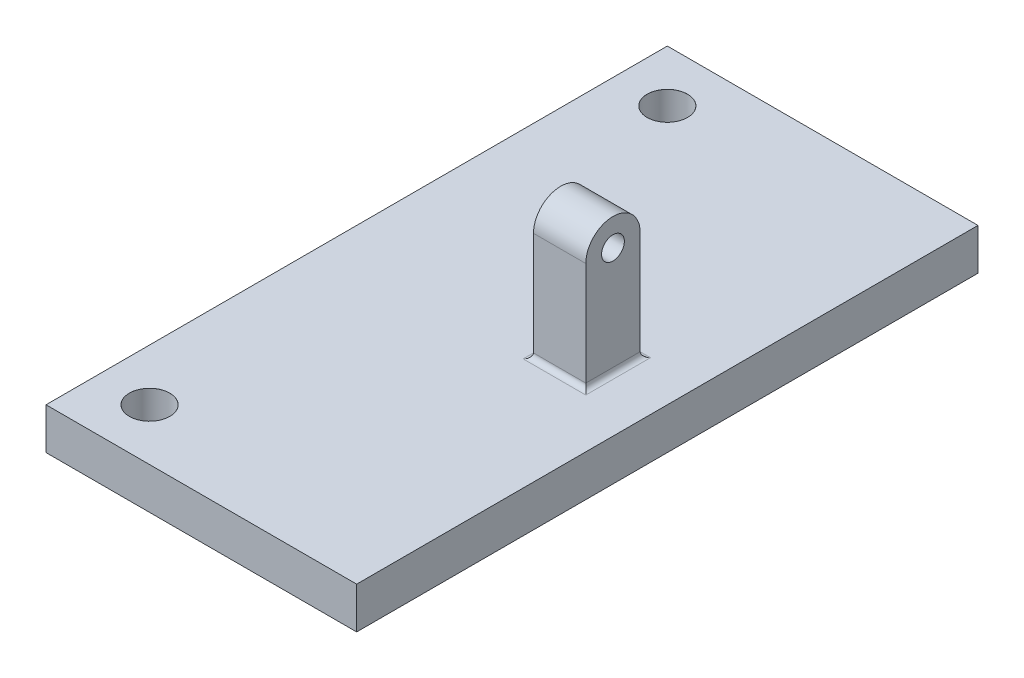
ISO-10303-21;
HEADER;
FILE_DESCRIPTION(('STEP AP214'),'2;1');
FILE_NAME('part.step','',(''),(''),'','','');
FILE_SCHEMA(('AUTOMOTIVE_DESIGN { 1 0 10303 214 1 1 1 1 }'));
ENDSEC;
DATA;
#1=APPLICATION_CONTEXT('core data for automotive mechanical design processes');
#2=APPLICATION_PROTOCOL_DEFINITION('international standard','automotive_design',2000,#1);
#3=PRODUCT_CONTEXT('',#1,'mechanical');
#4=PRODUCT('Part','Part','',(#3));
#5=PRODUCT_RELATED_PRODUCT_CATEGORY('part','',(#4));
#6=PRODUCT_DEFINITION_FORMATION('','',#4);
#7=PRODUCT_DEFINITION_CONTEXT('part definition',#1,'design');
#8=PRODUCT_DEFINITION('design','',#6,#7);
#9=PRODUCT_DEFINITION_SHAPE('','',#8);
#10=(LENGTH_UNIT() NAMED_UNIT(*) SI_UNIT(.MILLI.,.METRE.));
#11=(NAMED_UNIT(*) PLANE_ANGLE_UNIT() SI_UNIT($,.RADIAN.));
#12=(NAMED_UNIT(*) SI_UNIT($,.STERADIAN.) SOLID_ANGLE_UNIT());
#13=UNCERTAINTY_MEASURE_WITH_UNIT(LENGTH_MEASURE(1.E-05),#10,'distance_accuracy_value','');
#14=(GEOMETRIC_REPRESENTATION_CONTEXT(3) GLOBAL_UNCERTAINTY_ASSIGNED_CONTEXT((#13)) GLOBAL_UNIT_ASSIGNED_CONTEXT((#10,
#11,#12)) REPRESENTATION_CONTEXT('',''));
#15=CARTESIAN_POINT('',(0.,0.,0.));
#16=DIRECTION('',(0.,0.,1.));
#17=DIRECTION('',(1.,0.,0.));
#18=AXIS2_PLACEMENT_3D('',#15,#16,#17);
#19=CARTESIAN_POINT('',(50.5,0.,0.));
#20=DIRECTION('',(-1.,0.,0.));
#21=DIRECTION('',(0.,0.,1.));
#22=AXIS2_PLACEMENT_3D('',#19,#20,#21);
#23=CYLINDRICAL_SURFACE('',#22,26.25);
#24=CARTESIAN_POINT('',(0.,0.,0.));
#25=DIRECTION('',(1.,0.,0.));
#26=DIRECTION('',(0.,0.,1.));
#27=AXIS2_PLACEMENT_3D('',#24,#25,#26);
#28=CIRCLE('',#27,26.25);
#29=CARTESIAN_POINT('',(0.,0.,-26.25));
#30=VERTEX_POINT('',#29);
#31=CARTESIAN_POINT('',(0.,0.,26.25));
#32=VERTEX_POINT('',#31);
#33=EDGE_CURVE('E171',#30,#32,#28,.T.);
#34=ORIENTED_EDGE('',*,*,#33,.T.);
#35=DIRECTION('',(-1.,0.,0.));
#36=VECTOR('',#35,1.);
#37=CARTESIAN_POINT('',(50.5,0.,26.25));
#38=LINE('',#37,#36);
#39=CARTESIAN_POINT('',(50.5,0.,26.25));
#40=VERTEX_POINT('',#39);
#41=EDGE_CURVE('E195',#40,#32,#38,.T.);
#42=ORIENTED_EDGE('',*,*,#41,.F.);
#43=CARTESIAN_POINT('',(50.5,0.,0.));
#44=DIRECTION('',(1.,0.,0.));
#45=DIRECTION('',(0.,0.,1.));
#46=AXIS2_PLACEMENT_3D('',#43,#44,#45);
#47=CIRCLE('',#46,26.25);
#48=CARTESIAN_POINT('',(50.5,0.,-26.25));
#49=VERTEX_POINT('',#48);
#50=EDGE_CURVE('E172',#49,#40,#47,.T.);
#51=ORIENTED_EDGE('',*,*,#50,.F.);
#52=DIRECTION('',(-1.,0.,0.));
#53=VECTOR('',#52,1.);
#54=CARTESIAN_POINT('',(50.5,0.,-26.25));
#55=LINE('',#54,#53);
#56=EDGE_CURVE('E183',#49,#30,#55,.T.);
#57=ORIENTED_EDGE('',*,*,#56,.T.);
#58=EDGE_LOOP('',(#34,#42,#51,#57));
#59=FACE_BOUND('',#58,.T.);
#60=ADVANCED_FACE('F45',(#59),#23,.T.);
#61=CARTESIAN_POINT('',(50.5,0.,26.25));
#62=DIRECTION('',(0.,0.,-1.));
#63=DIRECTION('',(-1.,0.,0.));
#64=AXIS2_PLACEMENT_3D('',#61,#62,#63);
#65=PLANE('',#64);
#66=DIRECTION('',(0.,-1.,0.));
#67=VECTOR('',#66,1.);
#68=CARTESIAN_POINT('',(0.,0.,26.25));
#69=LINE('',#68,#67);
#70=CARTESIAN_POINT('',(0.,-100.,26.25));
#71=VERTEX_POINT('',#70);
#72=EDGE_CURVE('E187',#32,#71,#69,.T.);
#73=ORIENTED_EDGE('',*,*,#72,.T.);
#74=DIRECTION('',(-1.,0.,0.));
#75=VECTOR('',#74,1.);
#76=CARTESIAN_POINT('',(50.5,-100.,26.25));
#77=LINE('',#76,#75);
#78=CARTESIAN_POINT('',(50.5,-100.,26.25));
#79=VERTEX_POINT('',#78);
#80=EDGE_CURVE('E11',#71,#79,#77,.F.);
#81=ORIENTED_EDGE('',*,*,#80,.T.);
#82=DIRECTION('',(0.,-1.,0.));
#83=VECTOR('',#82,1.);
#84=CARTESIAN_POINT('',(50.5,0.,26.25));
#85=LINE('',#84,#83);
#86=EDGE_CURVE('E176',#40,#79,#85,.T.);
#87=ORIENTED_EDGE('',*,*,#86,.F.);
#88=ORIENTED_EDGE('',*,*,#41,.T.);
#89=EDGE_LOOP('',(#73,#81,#87,#88));
#90=FACE_BOUND('',#89,.T.);
#91=ADVANCED_FACE('F328',(#90),#65,.F.);
#92=CARTESIAN_POINT('',(50.5,-105.,-26.25));
#93=DIRECTION('',(0.,0.,1.));
#94=DIRECTION('',(1.,0.,0.));
#95=AXIS2_PLACEMENT_3D('',#92,#93,#94);
#96=PLANE('',#95);
#97=DIRECTION('',(0.,1.,0.));
#98=VECTOR('',#97,1.);
#99=CARTESIAN_POINT('',(50.5,-105.,-26.25));
#100=LINE('',#99,#98);
#101=CARTESIAN_POINT('',(50.5,-100.,-26.25));
#102=VERTEX_POINT('',#101);
#103=EDGE_CURVE('E180',#102,#49,#100,.T.);
#104=ORIENTED_EDGE('',*,*,#103,.F.);
#105=DIRECTION('',(-1.,0.,0.));
#106=VECTOR('',#105,1.);
#107=CARTESIAN_POINT('',(0.,-100.,-26.25));
#108=LINE('',#107,#106);
#109=CARTESIAN_POINT('',(0.,-100.,-26.25));
#110=VERTEX_POINT('',#109);
#111=EDGE_CURVE('E199',#102,#110,#108,.T.);
#112=ORIENTED_EDGE('',*,*,#111,.T.);
#113=DIRECTION('',(0.,1.,0.));
#114=VECTOR('',#113,1.);
#115=CARTESIAN_POINT('',(0.,-105.,-26.25));
#116=LINE('',#115,#114);
#117=EDGE_CURVE('E177',#110,#30,#116,.T.);
#118=ORIENTED_EDGE('',*,*,#117,.T.);
#119=ORIENTED_EDGE('',*,*,#56,.F.);
#120=EDGE_LOOP('',(#104,#112,#118,#119));
#121=FACE_BOUND('',#120,.T.);
#122=ADVANCED_FACE('F308',(#121),#96,.F.);
#123=CARTESIAN_POINT('',(50.5,0.,0.));
#124=DIRECTION('',(-1.,0.,0.));
#125=DIRECTION('',(0.,0.,1.));
#126=AXIS2_PLACEMENT_3D('',#123,#124,#125);
#127=PLANE('',#126);
#128=CARTESIAN_POINT('',(50.5,0.,0.));
#129=DIRECTION('',(-1.,0.,0.));
#130=DIRECTION('',(0.,0.,1.));
#131=AXIS2_PLACEMENT_3D('',#128,#129,#130);
#132=CIRCLE('',#131,11.);
#133=CARTESIAN_POINT('',(50.5,0.,11.));
#134=VERTEX_POINT('',#133);
#135=EDGE_CURVE('E167',#134,#134,#132,.T.);
#136=ORIENTED_EDGE('',*,*,#135,.T.);
#137=EDGE_LOOP('',(#136));
#138=FACE_BOUND('',#137,.T.);
#139=ORIENTED_EDGE('',*,*,#86,.T.);
#140=DIRECTION('',(0.,0.,-1.));
#141=VECTOR('',#140,1.);
#142=CARTESIAN_POINT('',(50.5,-100.,-26.25));
#143=LINE('',#142,#141);
#144=EDGE_CURVE('E55',#79,#102,#143,.T.);
#145=ORIENTED_EDGE('',*,*,#144,.T.);
#146=ORIENTED_EDGE('',*,*,#103,.T.);
#147=ORIENTED_EDGE('',*,*,#50,.T.);
#148=EDGE_LOOP('',(#139,#145,#146,#147));
#149=FACE_BOUND('',#148,.T.);
#150=ADVANCED_FACE('F316',(#138,#149),#127,.F.);
#151=CARTESIAN_POINT('',(0.,0.,0.));
#152=DIRECTION('',(-1.,0.,0.));
#153=DIRECTION('',(0.,0.,1.));
#154=AXIS2_PLACEMENT_3D('',#151,#152,#153);
#155=PLANE('',#154);
#156=CARTESIAN_POINT('',(0.,0.,0.));
#157=DIRECTION('',(-1.,0.,0.));
#158=DIRECTION('',(0.,0.,1.));
#159=AXIS2_PLACEMENT_3D('',#156,#157,#158);
#160=CIRCLE('',#159,11.025);
#161=CARTESIAN_POINT('',(0.,0.,11.025));
#162=VERTEX_POINT('',#161);
#163=EDGE_CURVE('E153',#162,#162,#160,.T.);
#164=ORIENTED_EDGE('',*,*,#163,.F.);
#165=EDGE_LOOP('',(#164));
#166=FACE_BOUND('',#165,.T.);
#167=ORIENTED_EDGE('',*,*,#117,.F.);
#168=DIRECTION('',(0.,0.,-1.));
#169=VECTOR('',#168,1.);
#170=CARTESIAN_POINT('',(0.,-100.,0.));
#171=LINE('',#170,#169);
#172=EDGE_CURVE('E69',#110,#71,#171,.F.);
#173=ORIENTED_EDGE('',*,*,#172,.T.);
#174=ORIENTED_EDGE('',*,*,#72,.F.);
#175=ORIENTED_EDGE('',*,*,#33,.F.);
#176=EDGE_LOOP('',(#167,#173,#174,#175));
#177=FACE_BOUND('',#176,.T.);
#178=ADVANCED_FACE('F311',(#166,#177),#155,.T.);
#179=CARTESIAN_POINT('',(0.,0.,0.));
#180=DIRECTION('',(-1.,0.,0.));
#181=DIRECTION('',(0.,0.,1.));
#182=AXIS2_PLACEMENT_3D('',#179,#180,#181);
#183=CYLINDRICAL_SURFACE('',#182,11.);
#184=ORIENTED_EDGE('',*,*,#135,.F.);
#185=EDGE_LOOP('',(#184));
#186=FACE_BOUND('',#185,.T.);
#187=CARTESIAN_POINT('',(0.0250000000000111,0.,0.));
#188=DIRECTION('',(-1.,0.,0.));
#189=DIRECTION('',(0.,0.,1.));
#190=AXIS2_PLACEMENT_3D('',#187,#188,#189);
#191=CIRCLE('',#190,11.);
#192=CARTESIAN_POINT('',(0.0250000000000111,0.,11.));
#193=VERTEX_POINT('',#192);
#194=EDGE_CURVE('E158',#193,#193,#191,.T.);
#195=ORIENTED_EDGE('',*,*,#194,.T.);
#196=EDGE_LOOP('',(#195));
#197=FACE_BOUND('',#196,.T.);
#198=ADVANCED_FACE('F447',(#186,#197),#183,.F.);
#199=CARTESIAN_POINT('',(0.,0.,0.));
#200=DIRECTION('',(-1.,0.,0.));
#201=DIRECTION('',(0.,0.,1.));
#202=AXIS2_PLACEMENT_3D('',#199,#200,#201);
#203=CONICAL_SURFACE('',#202,11.025,0.785398163397483);
#204=ORIENTED_EDGE('',*,*,#194,.F.);
#205=EDGE_LOOP('',(#204));
#206=FACE_BOUND('',#205,.T.);
#207=ORIENTED_EDGE('',*,*,#163,.T.);
#208=EDGE_LOOP('',(#207));
#209=FACE_BOUND('',#208,.T.);
#210=ADVANCED_FACE('F294',(#206,#209),#203,.F.);
#211=CARTESIAN_POINT('',(0.,-105.,0.));
#212=DIRECTION('',(0.,-1.,0.));
#213=DIRECTION('',(0.,0.,-1.));
#214=AXIS2_PLACEMENT_3D('',#211,#212,#213);
#215=PLANE('',#214);
#216=CARTESIAN_POINT('',(-147.,-105.,-250.));
#217=DIRECTION('',(0.,1.,0.));
#218=DIRECTION('',(0.,0.,1.));
#219=AXIS2_PLACEMENT_3D('',#216,#217,#218);
#220=CIRCLE('',#219,19.525);
#221=CARTESIAN_POINT('',(-147.,-105.,-230.475));
#222=VERTEX_POINT('',#221);
#223=EDGE_CURVE('E285',#222,#222,#220,.T.);
#224=ORIENTED_EDGE('',*,*,#223,.F.);
#225=EDGE_LOOP('',(#224));
#226=FACE_BOUND('',#225,.T.);
#227=CARTESIAN_POINT('',(-147.,-105.,250.));
#228=DIRECTION('',(0.,1.,0.));
#229=DIRECTION('',(0.,0.,1.));
#230=AXIS2_PLACEMENT_3D('',#227,#228,#229);
#231=CIRCLE('',#230,19.525);
#232=CARTESIAN_POINT('',(-147.,-105.,269.525));
#233=VERTEX_POINT('',#232);
#234=EDGE_CURVE('E273',#233,#233,#231,.T.);
#235=ORIENTED_EDGE('',*,*,#234,.F.);
#236=EDGE_LOOP('',(#235));
#237=FACE_BOUND('',#236,.T.);
#238=DIRECTION('',(0.,0.,-1.));
#239=VECTOR('',#238,1.);
#240=CARTESIAN_POINT('',(-5.,-105.,0.));
#241=LINE('',#240,#239);
#242=CARTESIAN_POINT('',(-5.,-105.,31.25));
#243=VERTEX_POINT('',#242);
#244=CARTESIAN_POINT('',(-5.,-105.,-31.25));
#245=VERTEX_POINT('',#244);
#246=EDGE_CURVE('E209',#243,#245,#241,.T.);
#247=ORIENTED_EDGE('',*,*,#246,.T.);
#248=DIRECTION('',(-1.,0.,0.));
#249=VECTOR('',#248,1.);
#250=CARTESIAN_POINT('',(50.5,-105.,-31.25));
#251=LINE('',#250,#249);
#252=CARTESIAN_POINT('',(55.5,-105.,-31.25));
#253=VERTEX_POINT('',#252);
#254=EDGE_CURVE('E212',#245,#253,#251,.F.);
#255=ORIENTED_EDGE('',*,*,#254,.T.);
#256=DIRECTION('',(0.,0.,-1.));
#257=VECTOR('',#256,1.);
#258=CARTESIAN_POINT('',(55.5,-105.,26.25));
#259=LINE('',#258,#257);
#260=CARTESIAN_POINT('',(55.5,-105.,31.25));
#261=VERTEX_POINT('',#260);
#262=EDGE_CURVE('E206',#253,#261,#259,.F.);
#263=ORIENTED_EDGE('',*,*,#262,.T.);
#264=DIRECTION('',(-1.,0.,0.));
#265=VECTOR('',#264,1.);
#266=CARTESIAN_POINT('',(0.,-105.,31.25));
#267=LINE('',#266,#265);
#268=EDGE_CURVE('E203',#261,#243,#267,.T.);
#269=ORIENTED_EDGE('',*,*,#268,.T.);
#270=EDGE_LOOP('',(#247,#255,#263,#269));
#271=FACE_BOUND('',#270,.T.);
#272=DIRECTION('',(0.,0.,-1.));
#273=VECTOR('',#272,1.);
#274=CARTESIAN_POINT('',(-197.,-105.,300.));
#275=LINE('',#274,#273);
#276=CARTESIAN_POINT('',(-197.,-105.,300.));
#277=VERTEX_POINT('',#276);
#278=CARTESIAN_POINT('',(-197.,-105.,-300.));
#279=VERTEX_POINT('',#278);
#280=EDGE_CURVE('E151',#277,#279,#275,.T.);
#281=ORIENTED_EDGE('',*,*,#280,.F.);
#282=DIRECTION('',(-1.,0.,0.));
#283=VECTOR('',#282,1.);
#284=CARTESIAN_POINT('',(103.,-105.,300.));
#285=LINE('',#284,#283);
#286=CARTESIAN_POINT('',(103.,-105.,300.));
#287=VERTEX_POINT('',#286);
#288=EDGE_CURVE('E147',#287,#277,#285,.T.);
#289=ORIENTED_EDGE('',*,*,#288,.F.);
#290=DIRECTION('',(0.,0.,1.));
#291=VECTOR('',#290,1.);
#292=CARTESIAN_POINT('',(103.,-105.,0.));
#293=LINE('',#292,#291);
#294=CARTESIAN_POINT('',(103.,-105.,-300.));
#295=VERTEX_POINT('',#294);
#296=EDGE_CURVE('E242',#295,#287,#293,.T.);
#297=ORIENTED_EDGE('',*,*,#296,.F.);
#298=DIRECTION('',(1.,0.,0.));
#299=VECTOR('',#298,1.);
#300=CARTESIAN_POINT('',(-197.,-105.,-300.));
#301=LINE('',#300,#299);
#302=EDGE_CURVE('E239',#279,#295,#301,.T.);
#303=ORIENTED_EDGE('',*,*,#302,.F.);
#304=EDGE_LOOP('',(#281,#289,#297,#303));
#305=FACE_BOUND('',#304,.T.);
#306=ADVANCED_FACE('F261',(#226,#237,#271,#305),#215,.F.);
#307=CARTESIAN_POINT('',(-197.,-145.,300.));
#308=DIRECTION('',(1.,0.,0.));
#309=DIRECTION('',(0.,0.,-1.));
#310=AXIS2_PLACEMENT_3D('',#307,#308,#309);
#311=PLANE('',#310);
#312=ORIENTED_EDGE('',*,*,#280,.T.);
#313=DIRECTION('',(0.,1.,0.));
#314=VECTOR('',#313,1.);
#315=CARTESIAN_POINT('',(-197.,-145.,-300.));
#316=LINE('',#315,#314);
#317=CARTESIAN_POINT('',(-197.,-145.,-300.));
#318=VERTEX_POINT('',#317);
#319=EDGE_CURVE('E129',#318,#279,#316,.T.);
#320=ORIENTED_EDGE('',*,*,#319,.F.);
#321=DIRECTION('',(0.,0.,-1.));
#322=VECTOR('',#321,1.);
#323=CARTESIAN_POINT('',(-197.,-145.,300.));
#324=LINE('',#323,#322);
#325=CARTESIAN_POINT('',(-197.,-145.,300.));
#326=VERTEX_POINT('',#325);
#327=EDGE_CURVE('E137',#326,#318,#324,.T.);
#328=ORIENTED_EDGE('',*,*,#327,.F.);
#329=DIRECTION('',(0.,1.,0.));
#330=VECTOR('',#329,1.);
#331=CARTESIAN_POINT('',(-197.,-145.,300.));
#332=LINE('',#331,#330);
#333=EDGE_CURVE('E251',#326,#277,#332,.T.);
#334=ORIENTED_EDGE('',*,*,#333,.T.);
#335=EDGE_LOOP('',(#312,#320,#328,#334));
#336=FACE_BOUND('',#335,.T.);
#337=ADVANCED_FACE('F149',(#336),#311,.F.);
#338=CARTESIAN_POINT('',(-197.,-145.,-300.));
#339=DIRECTION('',(0.,0.,1.));
#340=DIRECTION('',(1.,0.,0.));
#341=AXIS2_PLACEMENT_3D('',#338,#339,#340);
#342=PLANE('',#341);
#343=ORIENTED_EDGE('',*,*,#302,.T.);
#344=DIRECTION('',(0.,1.,0.));
#345=VECTOR('',#344,1.);
#346=CARTESIAN_POINT('',(103.,-145.,-300.));
#347=LINE('',#346,#345);
#348=CARTESIAN_POINT('',(103.,-145.,-300.));
#349=VERTEX_POINT('',#348);
#350=EDGE_CURVE('E132',#349,#295,#347,.T.);
#351=ORIENTED_EDGE('',*,*,#350,.F.);
#352=DIRECTION('',(1.,0.,0.));
#353=VECTOR('',#352,1.);
#354=CARTESIAN_POINT('',(-197.,-145.,-300.));
#355=LINE('',#354,#353);
#356=EDGE_CURVE('E124',#318,#349,#355,.T.);
#357=ORIENTED_EDGE('',*,*,#356,.F.);
#358=ORIENTED_EDGE('',*,*,#319,.T.);
#359=EDGE_LOOP('',(#343,#351,#357,#358));
#360=FACE_BOUND('',#359,.T.);
#361=ADVANCED_FACE('F127',(#360),#342,.F.);
#362=CARTESIAN_POINT('',(103.,-145.,0.));
#363=DIRECTION('',(-1.,0.,0.));
#364=DIRECTION('',(0.,0.,1.));
#365=AXIS2_PLACEMENT_3D('',#362,#363,#364);
#366=PLANE('',#365);
#367=ORIENTED_EDGE('',*,*,#296,.T.);
#368=DIRECTION('',(0.,1.,0.));
#369=VECTOR('',#368,1.);
#370=CARTESIAN_POINT('',(103.,-145.,300.));
#371=LINE('',#370,#369);
#372=CARTESIAN_POINT('',(103.,-145.,300.));
#373=VERTEX_POINT('',#372);
#374=EDGE_CURVE('E160',#373,#287,#371,.T.);
#375=ORIENTED_EDGE('',*,*,#374,.F.);
#376=DIRECTION('',(0.,0.,1.));
#377=VECTOR('',#376,1.);
#378=CARTESIAN_POINT('',(103.,-145.,-300.));
#379=LINE('',#378,#377);
#380=EDGE_CURVE('E136',#349,#373,#379,.T.);
#381=ORIENTED_EDGE('',*,*,#380,.F.);
#382=ORIENTED_EDGE('',*,*,#350,.T.);
#383=EDGE_LOOP('',(#367,#375,#381,#382));
#384=FACE_BOUND('',#383,.T.);
#385=ADVANCED_FACE('F262',(#384),#366,.F.);
#386=CARTESIAN_POINT('',(103.,-145.,300.));
#387=DIRECTION('',(0.,0.,-1.));
#388=DIRECTION('',(-1.,0.,0.));
#389=AXIS2_PLACEMENT_3D('',#386,#387,#388);
#390=PLANE('',#389);
#391=ORIENTED_EDGE('',*,*,#288,.T.);
#392=ORIENTED_EDGE('',*,*,#333,.F.);
#393=DIRECTION('',(-1.,0.,0.));
#394=VECTOR('',#393,1.);
#395=CARTESIAN_POINT('',(103.,-145.,300.));
#396=LINE('',#395,#394);
#397=EDGE_CURVE('E142',#373,#326,#396,.T.);
#398=ORIENTED_EDGE('',*,*,#397,.F.);
#399=ORIENTED_EDGE('',*,*,#374,.T.);
#400=EDGE_LOOP('',(#391,#392,#398,#399));
#401=FACE_BOUND('',#400,.T.);
#402=ADVANCED_FACE('F258',(#401),#390,.F.);
#403=CARTESIAN_POINT('',(0.,-145.,0.));
#404=DIRECTION('',(0.,-1.,0.));
#405=DIRECTION('',(0.,0.,-1.));
#406=AXIS2_PLACEMENT_3D('',#403,#404,#405);
#407=PLANE('',#406);
#408=CARTESIAN_POINT('',(-147.,-145.,-250.));
#409=DIRECTION('',(0.,1.,0.));
#410=DIRECTION('',(0.,0.,1.));
#411=AXIS2_PLACEMENT_3D('',#408,#409,#410);
#412=CIRCLE('',#411,19.5);
#413=CARTESIAN_POINT('',(-147.,-145.,-230.5));
#414=VERTEX_POINT('',#413);
#415=EDGE_CURVE('E277',#414,#414,#412,.T.);
#416=ORIENTED_EDGE('',*,*,#415,.T.);
#417=EDGE_LOOP('',(#416));
#418=FACE_BOUND('',#417,.T.);
#419=CARTESIAN_POINT('',(-147.,-145.,250.));
#420=DIRECTION('',(0.,1.,0.));
#421=DIRECTION('',(0.,0.,1.));
#422=AXIS2_PLACEMENT_3D('',#419,#420,#421);
#423=CIRCLE('',#422,19.5);
#424=CARTESIAN_POINT('',(-147.,-145.,269.5));
#425=VERTEX_POINT('',#424);
#426=EDGE_CURVE('E224',#425,#425,#423,.T.);
#427=ORIENTED_EDGE('',*,*,#426,.T.);
#428=EDGE_LOOP('',(#427));
#429=FACE_BOUND('',#428,.T.);
#430=ORIENTED_EDGE('',*,*,#327,.T.);
#431=ORIENTED_EDGE('',*,*,#356,.T.);
#432=ORIENTED_EDGE('',*,*,#380,.T.);
#433=ORIENTED_EDGE('',*,*,#397,.T.);
#434=EDGE_LOOP('',(#430,#431,#432,#433));
#435=FACE_BOUND('',#434,.T.);
#436=ADVANCED_FACE('F140',(#418,#429,#435),#407,.T.);
#437=CARTESIAN_POINT('',(0.,-100.,31.25));
#438=DIRECTION('',(1.,0.,0.));
#439=DIRECTION('',(0.,0.,-1.));
#440=AXIS2_PLACEMENT_3D('',#437,#438,#439);
#441=CYLINDRICAL_SURFACE('',#440,5.);
#442=CARTESIAN_POINT('',(-5.,-100.,31.25));
#443=DIRECTION('',(0.707106781186547,0.,0.707106781186547));
#444=DIRECTION('',(0.707106781186547,0.,-0.707106781186547));
#445=AXIS2_PLACEMENT_3D('',#442,#443,#444);
#446=ELLIPSE('',#445,7.07106781186547,5.);
#447=EDGE_CURVE('E226',#243,#71,#446,.T.);
#448=ORIENTED_EDGE('',*,*,#447,.F.);
#449=ORIENTED_EDGE('',*,*,#268,.F.);
#450=CARTESIAN_POINT('',(55.5,-100.,31.25));
#451=DIRECTION('',(0.707106781186547,0.,-0.707106781186547));
#452=DIRECTION('',(0.707106781186547,0.,0.707106781186547));
#453=AXIS2_PLACEMENT_3D('',#450,#451,#452);
#454=ELLIPSE('',#453,7.07106781186547,5.);
#455=EDGE_CURVE('E49',#79,#261,#454,.F.);
#456=ORIENTED_EDGE('',*,*,#455,.F.);
#457=ORIENTED_EDGE('',*,*,#80,.F.);
#458=EDGE_LOOP('',(#448,#449,#456,#457));
#459=FACE_BOUND('',#458,.T.);
#460=ADVANCED_FACE('F47',(#459),#441,.F.);
#461=CARTESIAN_POINT('',(55.5,-100.,0.));
#462=DIRECTION('',(0.,0.,1.));
#463=DIRECTION('',(1.,0.,0.));
#464=AXIS2_PLACEMENT_3D('',#461,#462,#463);
#465=CYLINDRICAL_SURFACE('',#464,5.);
#466=ORIENTED_EDGE('',*,*,#455,.T.);
#467=ORIENTED_EDGE('',*,*,#262,.F.);
#468=CARTESIAN_POINT('',(55.5,-100.,-31.25));
#469=DIRECTION('',(0.707106781186547,0.,0.707106781186547));
#470=DIRECTION('',(-0.707106781186547,0.,0.707106781186547));
#471=AXIS2_PLACEMENT_3D('',#468,#469,#470);
#472=ELLIPSE('',#471,7.07106781186547,5.);
#473=EDGE_CURVE('E223',#102,#253,#472,.T.);
#474=ORIENTED_EDGE('',*,*,#473,.F.);
#475=ORIENTED_EDGE('',*,*,#144,.F.);
#476=EDGE_LOOP('',(#466,#467,#474,#475));
#477=FACE_BOUND('',#476,.T.);
#478=ADVANCED_FACE('F317',(#477),#465,.F.);
#479=CARTESIAN_POINT('',(-5.,-100.,0.));
#480=DIRECTION('',(0.,0.,-1.));
#481=DIRECTION('',(-1.,0.,0.));
#482=AXIS2_PLACEMENT_3D('',#479,#480,#481);
#483=CYLINDRICAL_SURFACE('',#482,5.);
#484=ORIENTED_EDGE('',*,*,#447,.T.);
#485=ORIENTED_EDGE('',*,*,#172,.F.);
#486=CARTESIAN_POINT('',(-5.,-100.,-31.25));
#487=DIRECTION('',(0.707106781186547,0.,-0.707106781186547));
#488=DIRECTION('',(-0.707106781186547,0.,-0.707106781186547));
#489=AXIS2_PLACEMENT_3D('',#486,#487,#488);
#490=ELLIPSE('',#489,7.07106781186547,5.);
#491=EDGE_CURVE('E220',#245,#110,#490,.F.);
#492=ORIENTED_EDGE('',*,*,#491,.F.);
#493=ORIENTED_EDGE('',*,*,#246,.F.);
#494=EDGE_LOOP('',(#484,#485,#492,#493));
#495=FACE_BOUND('',#494,.T.);
#496=ADVANCED_FACE('F305',(#495),#483,.F.);
#497=CARTESIAN_POINT('',(50.5,-100.,-31.25));
#498=DIRECTION('',(1.,0.,0.));
#499=DIRECTION('',(0.,0.,-1.));
#500=AXIS2_PLACEMENT_3D('',#497,#498,#499);
#501=CYLINDRICAL_SURFACE('',#500,5.);
#502=ORIENTED_EDGE('',*,*,#473,.T.);
#503=ORIENTED_EDGE('',*,*,#254,.F.);
#504=ORIENTED_EDGE('',*,*,#491,.T.);
#505=ORIENTED_EDGE('',*,*,#111,.F.);
#506=EDGE_LOOP('',(#502,#503,#504,#505));
#507=FACE_BOUND('',#506,.T.);
#508=ADVANCED_FACE('F302',(#507),#501,.F.);
#509=CARTESIAN_POINT('',(-147.,-105.,250.));
#510=DIRECTION('',(0.,1.,0.));
#511=DIRECTION('',(0.,0.,1.));
#512=AXIS2_PLACEMENT_3D('',#509,#510,#511);
#513=CYLINDRICAL_SURFACE('',#512,19.5);
#514=ORIENTED_EDGE('',*,*,#426,.F.);
#515=EDGE_LOOP('',(#514));
#516=FACE_BOUND('',#515,.T.);
#517=CARTESIAN_POINT('',(-147.,-105.025,250.));
#518=DIRECTION('',(0.,1.,0.));
#519=DIRECTION('',(0.,0.,1.));
#520=AXIS2_PLACEMENT_3D('',#517,#518,#519);
#521=CIRCLE('',#520,19.5);
#522=CARTESIAN_POINT('',(-147.,-105.025,269.5));
#523=VERTEX_POINT('',#522);
#524=EDGE_CURVE('E269',#523,#523,#521,.T.);
#525=ORIENTED_EDGE('',*,*,#524,.T.);
#526=EDGE_LOOP('',(#525));
#527=FACE_BOUND('',#526,.T.);
#528=ADVANCED_FACE('F339',(#516,#527),#513,.F.);
#529=CARTESIAN_POINT('',(-147.,-105.,250.));
#530=DIRECTION('',(0.,1.,0.));
#531=DIRECTION('',(0.,0.,1.));
#532=AXIS2_PLACEMENT_3D('',#529,#530,#531);
#533=CONICAL_SURFACE('',#532,19.525,0.785398163397726);
#534=ORIENTED_EDGE('',*,*,#524,.F.);
#535=EDGE_LOOP('',(#534));
#536=FACE_BOUND('',#535,.T.);
#537=ORIENTED_EDGE('',*,*,#234,.T.);
#538=EDGE_LOOP('',(#537));
#539=FACE_BOUND('',#538,.T.);
#540=ADVANCED_FACE('F370',(#536,#539),#533,.F.);
#541=CARTESIAN_POINT('',(-147.,-105.,-250.));
#542=DIRECTION('',(0.,1.,0.));
#543=DIRECTION('',(0.,0.,1.));
#544=AXIS2_PLACEMENT_3D('',#541,#542,#543);
#545=CYLINDRICAL_SURFACE('',#544,19.5);
#546=ORIENTED_EDGE('',*,*,#415,.F.);
#547=EDGE_LOOP('',(#546));
#548=FACE_BOUND('',#547,.T.);
#549=CARTESIAN_POINT('',(-147.,-105.025,-250.));
#550=DIRECTION('',(0.,1.,0.));
#551=DIRECTION('',(0.,0.,1.));
#552=AXIS2_PLACEMENT_3D('',#549,#550,#551);
#553=CIRCLE('',#552,19.5);
#554=CARTESIAN_POINT('',(-147.,-105.025,-230.5));
#555=VERTEX_POINT('',#554);
#556=EDGE_CURVE('E281',#555,#555,#553,.T.);
#557=ORIENTED_EDGE('',*,*,#556,.T.);
#558=EDGE_LOOP('',(#557));
#559=FACE_BOUND('',#558,.T.);
#560=ADVANCED_FACE('F379',(#548,#559),#545,.F.);
#561=CARTESIAN_POINT('',(-147.,-105.,-250.));
#562=DIRECTION('',(0.,1.,0.));
#563=DIRECTION('',(0.,0.,1.));
#564=AXIS2_PLACEMENT_3D('',#561,#562,#563);
#565=CONICAL_SURFACE('',#564,19.525,0.785398163397726);
#566=ORIENTED_EDGE('',*,*,#556,.F.);
#567=EDGE_LOOP('',(#566));
#568=FACE_BOUND('',#567,.T.);
#569=ORIENTED_EDGE('',*,*,#223,.T.);
#570=EDGE_LOOP('',(#569));
#571=FACE_BOUND('',#570,.T.);
#572=ADVANCED_FACE('F290',(#568,#571),#565,.F.);
#573=CLOSED_SHELL('',(#60,#91,#122,#150,#178,#198,#210,#306,#337,#361,#385,#402,#436,#460,#478,
#496,#508,#528,#540,#560,#572));
#574=MANIFOLD_SOLID_BREP('B2',#573);
#575=ADVANCED_BREP_SHAPE_REPRESENTATION('',(#18,#574),#14);
#576=SHAPE_DEFINITION_REPRESENTATION(#9,#575);
ENDSEC;
END-ISO-10303-21;
